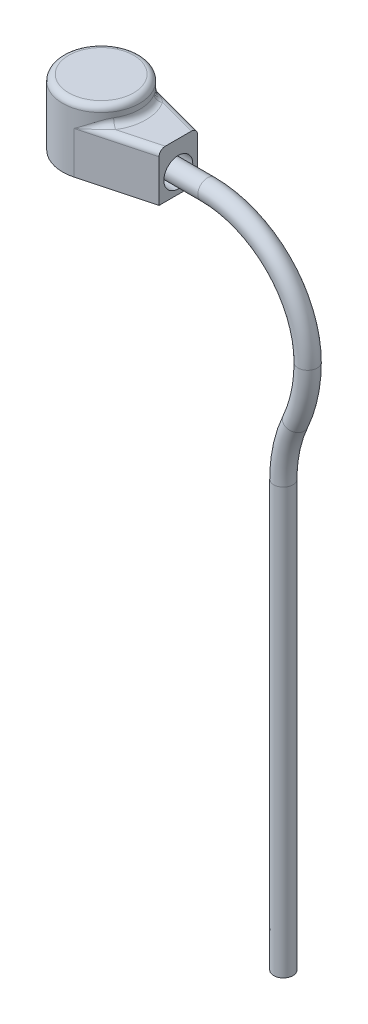
ISO-10303-21;
HEADER;
FILE_DESCRIPTION(('STEP AP214'),'2;1');
FILE_NAME('part.step','',(''),(''),'','','');
FILE_SCHEMA(('AUTOMOTIVE_DESIGN { 1 0 10303 214 1 1 1 1 }'));
ENDSEC;
DATA;
#1=APPLICATION_CONTEXT('core data for automotive mechanical design processes');
#2=APPLICATION_PROTOCOL_DEFINITION('international standard','automotive_design',2000,#1);
#3=PRODUCT_CONTEXT('',#1,'mechanical');
#4=PRODUCT('Part','Part','',(#3));
#5=PRODUCT_RELATED_PRODUCT_CATEGORY('part','',(#4));
#6=PRODUCT_DEFINITION_FORMATION('','',#4);
#7=PRODUCT_DEFINITION_CONTEXT('part definition',#1,'design');
#8=PRODUCT_DEFINITION('design','',#6,#7);
#9=PRODUCT_DEFINITION_SHAPE('','',#8);
#10=(LENGTH_UNIT() NAMED_UNIT(*) SI_UNIT(.MILLI.,.METRE.));
#11=(NAMED_UNIT(*) PLANE_ANGLE_UNIT() SI_UNIT($,.RADIAN.));
#12=(NAMED_UNIT(*) SI_UNIT($,.STERADIAN.) SOLID_ANGLE_UNIT());
#13=UNCERTAINTY_MEASURE_WITH_UNIT(LENGTH_MEASURE(1.E-05),#10,'distance_accuracy_value','');
#14=(GEOMETRIC_REPRESENTATION_CONTEXT(3) GLOBAL_UNCERTAINTY_ASSIGNED_CONTEXT((#13)) GLOBAL_UNIT_ASSIGNED_CONTEXT((#10,
#11,#12)) REPRESENTATION_CONTEXT('',''));
#15=CARTESIAN_POINT('',(0.,0.,0.));
#16=DIRECTION('',(0.,0.,1.));
#17=DIRECTION('',(1.,0.,0.));
#18=AXIS2_PLACEMENT_3D('',#15,#16,#17);
#19=CARTESIAN_POINT('',(9.99999999999999,3.175,0.));
#20=DIRECTION('',(1.,0.,0.));
#21=DIRECTION('',(0.,1.,0.));
#22=AXIS2_PLACEMENT_3D('',#19,#20,#21);
#23=PLANE('',#22);
#24=CARTESIAN_POINT('',(9.99999999999999,3.175,0.));
#25=DIRECTION('',(1.,0.,0.));
#26=DIRECTION('',(0.,1.,0.));
#27=AXIS2_PLACEMENT_3D('',#24,#25,#26);
#28=CIRCLE('',#27,1.5875);
#29=CARTESIAN_POINT('',(9.99999999999999,4.7625,0.));
#30=VERTEX_POINT('',#29);
#31=EDGE_CURVE('E70',#30,#30,#28,.T.);
#32=ORIENTED_EDGE('',*,*,#31,.F.);
#33=EDGE_LOOP('',(#32));
#34=FACE_BOUND('',#33,.T.);
#35=ADVANCED_FACE('F48',(#34),#23,.F.);
#36=CARTESIAN_POINT('',(30.,-101.979758106178,0.));
#37=DIRECTION('',(0.,-1.,0.));
#38=DIRECTION('',(1.,0.,0.));
#39=AXIS2_PLACEMENT_3D('',#36,#37,#38);
#40=PLANE('',#39);
#41=CARTESIAN_POINT('',(30.,-101.979758106178,0.));
#42=DIRECTION('',(0.,-1.,0.));
#43=DIRECTION('',(1.,0.,0.));
#44=AXIS2_PLACEMENT_3D('',#41,#42,#43);
#45=CIRCLE('',#44,1.5875);
#46=CARTESIAN_POINT('',(31.5875,-101.979758106178,0.));
#47=VERTEX_POINT('',#46);
#48=EDGE_CURVE('E11',#47,#47,#45,.T.);
#49=ORIENTED_EDGE('',*,*,#48,.T.);
#50=EDGE_LOOP('',(#49));
#51=FACE_BOUND('',#50,.T.);
#52=ADVANCED_FACE('F77',(#51),#40,.T.);
#53=CARTESIAN_POINT('',(9.99999999999999,3.175,0.));
#54=DIRECTION('',(1.,0.,0.));
#55=DIRECTION('',(0.,1.,0.));
#56=AXIS2_PLACEMENT_3D('',#53,#54,#55);
#57=CYLINDRICAL_SURFACE('',#56,1.5875);
#58=CARTESIAN_POINT('',(17.5,3.175,0.));
#59=DIRECTION('',(1.,0.,0.));
#60=DIRECTION('',(0.,1.,0.));
#61=AXIS2_PLACEMENT_3D('',#58,#59,#60);
#62=CIRCLE('',#61,1.5875);
#63=CARTESIAN_POINT('',(17.5,4.7625,0.));
#64=VERTEX_POINT('',#63);
#65=EDGE_CURVE('E67',#64,#64,#62,.T.);
#66=ORIENTED_EDGE('',*,*,#65,.F.);
#67=EDGE_LOOP('',(#66));
#68=FACE_BOUND('',#67,.T.);
#69=ORIENTED_EDGE('',*,*,#31,.T.);
#70=EDGE_LOOP('',(#69));
#71=FACE_BOUND('',#70,.T.);
#72=ADVANCED_FACE('F74',(#68,#71),#57,.T.);
#73=CARTESIAN_POINT('',(17.5,-13.325,0.));
#74=DIRECTION('',(0.,0.,-1.));
#75=DIRECTION('',(-1.,0.,0.));
#76=AXIS2_PLACEMENT_3D('',#73,#74,#75);
#77=TOROIDAL_SURFACE('',#76,16.5,1.5875);
#78=CARTESIAN_POINT('',(34.,-13.325,0.));
#79=DIRECTION('',(0.,-1.,0.));
#80=DIRECTION('',(1.,0.,0.));
#81=AXIS2_PLACEMENT_3D('',#78,#79,#80);
#82=CIRCLE('',#81,1.5875);
#83=CARTESIAN_POINT('',(35.5875,-13.325,0.));
#84=VERTEX_POINT('',#83);
#85=EDGE_CURVE('E62',#84,#84,#82,.T.);
#86=CARTESIAN_POINT('',(17.5,-13.325,0.));
#87=DIRECTION('',(0.,0.,-1.));
#88=DIRECTION('',(-1.,0.,0.));
#89=AXIS2_PLACEMENT_3D('',#86,#87,#88);
#90=CIRCLE('',#89,18.0875);
#91=EDGE_CURVE('',#64,#84,#90,.T.);
#92=ORIENTED_EDGE('',*,*,#65,.T.);
#93=ORIENTED_EDGE('',*,*,#85,.F.);
#94=ORIENTED_EDGE('',*,*,#91,.T.);
#95=ORIENTED_EDGE('',*,*,#91,.F.);
#96=EDGE_LOOP('',(#92,#94,#93,#95));
#97=FACE_BOUND('',#96,.T.);
#98=ADVANCED_FACE('F95',(#97),#77,.T.);
#99=CARTESIAN_POINT('',(11.,-13.325,0.));
#100=DIRECTION('',(0.,0.,-1.));
#101=DIRECTION('',(-1.,0.,0.));
#102=AXIS2_PLACEMENT_3D('',#99,#100,#101);
#103=TOROIDAL_SURFACE('',#102,23.,1.5875);
#104=CARTESIAN_POINT('',(31.978021978022,-22.7548777240019,0.));
#105=DIRECTION('',(-0.409994683652255,-0.912087912087912,0.));
#106=DIRECTION('',(0.912087912087912,-0.409994683652255,0.));
#107=AXIS2_PLACEMENT_3D('',#104,#105,#106);
#108=CIRCLE('',#107,1.5875);
#109=CARTESIAN_POINT('',(33.4259615384615,-23.4057442842998,0.));
#110=VERTEX_POINT('',#109);
#111=EDGE_CURVE('E58',#110,#110,#108,.T.);
#112=CARTESIAN_POINT('',(11.,-13.325,0.));
#113=DIRECTION('',(0.,0.,-1.));
#114=DIRECTION('',(-1.,0.,0.));
#115=AXIS2_PLACEMENT_3D('',#112,#113,#114);
#116=CIRCLE('',#115,24.5875);
#117=EDGE_CURVE('',#84,#110,#116,.T.);
#118=ORIENTED_EDGE('',*,*,#85,.T.);
#119=ORIENTED_EDGE('',*,*,#111,.F.);
#120=ORIENTED_EDGE('',*,*,#117,.T.);
#121=ORIENTED_EDGE('',*,*,#117,.F.);
#122=EDGE_LOOP('',(#118,#120,#119,#121));
#123=FACE_BOUND('',#122,.T.);
#124=ADVANCED_FACE('F89',(#123),#103,.T.);
#125=CARTESIAN_POINT('',(52.5,-31.9797581061776,0.));
#126=DIRECTION('',(0.,0.,1.));
#127=DIRECTION('',(1.,0.,0.));
#128=AXIS2_PLACEMENT_3D('',#125,#126,#127);
#129=TOROIDAL_SURFACE('',#128,22.5,1.5875);
#130=CARTESIAN_POINT('',(30.,-31.9797581061776,0.));
#131=DIRECTION('',(0.,-1.,0.));
#132=DIRECTION('',(1.,0.,0.));
#133=AXIS2_PLACEMENT_3D('',#130,#131,#132);
#134=CIRCLE('',#133,1.5875);
#135=CARTESIAN_POINT('',(31.5875,-31.9797581061776,0.));
#136=VERTEX_POINT('',#135);
#137=EDGE_CURVE('E54',#136,#136,#134,.T.);
#138=ORIENTED_EDGE('',*,*,#137,.F.);
#139=EDGE_LOOP('',(#138));
#140=FACE_BOUND('',#139,.T.);
#141=ORIENTED_EDGE('',*,*,#111,.T.);
#142=EDGE_LOOP('',(#141));
#143=FACE_BOUND('',#142,.T.);
#144=ADVANCED_FACE('F83',(#140,#143),#129,.T.);
#145=CARTESIAN_POINT('',(30.,-31.9797581061776,0.));
#146=DIRECTION('',(0.,-1.,0.));
#147=DIRECTION('',(1.,0.,0.));
#148=AXIS2_PLACEMENT_3D('',#145,#146,#147);
#149=CYLINDRICAL_SURFACE('',#148,1.5875);
#150=ORIENTED_EDGE('',*,*,#48,.F.);
#151=EDGE_LOOP('',(#150));
#152=FACE_BOUND('',#151,.T.);
#153=ORIENTED_EDGE('',*,*,#137,.T.);
#154=EDGE_LOOP('',(#153));
#155=FACE_BOUND('',#154,.T.);
#156=ADVANCED_FACE('F81',(#152,#155),#149,.T.);
#157=CLOSED_SHELL('',(#35,#52,#72,#98,#124,#144,#156));
#158=MANIFOLD_SOLID_BREP('B2',#157);
#159=CARTESIAN_POINT('',(0.,10.795,0.));
#160=DIRECTION('',(0.,-1.,0.));
#161=DIRECTION('',(0.,0.,-1.));
#162=AXIS2_PLACEMENT_3D('',#159,#160,#161);
#163=CYLINDRICAL_SURFACE('',#162,6.35);
#164=CARTESIAN_POINT('',(0.,9.795,0.));
#165=DIRECTION('',(0.,1.,0.));
#166=DIRECTION('',(0.,0.,1.));
#167=AXIS2_PLACEMENT_3D('',#164,#165,#166);
#168=CIRCLE('',#167,6.35);
#169=CARTESIAN_POINT('',(0.,9.795,6.35));
#170=VERTEX_POINT('',#169);
#171=EDGE_CURVE('E259',#170,#170,#168,.F.);
#172=ORIENTED_EDGE('',*,*,#171,.T.);
#173=EDGE_LOOP('',(#172));
#174=FACE_BOUND('',#173,.T.);
#175=CARTESIAN_POINT('',(0.,8.9375,0.));
#176=DIRECTION('',(0.,1.,0.));
#177=DIRECTION('',(0.,0.,1.));
#178=AXIS2_PLACEMENT_3D('',#175,#176,#177);
#179=CIRCLE('',#178,6.35);
#180=CARTESIAN_POINT('',(5.40096125308822,8.9375,3.33947863335577));
#181=VERTEX_POINT('',#180);
#182=CARTESIAN_POINT('',(5.40096125308822,8.9375,-3.33947863335577));
#183=VERTEX_POINT('',#182);
#184=EDGE_CURVE('E262',#181,#183,#179,.T.);
#185=ORIENTED_EDGE('',*,*,#184,.T.);
#186=CARTESIAN_POINT('',(5.80509051941081,8.79737296245185,-2.57360137967144));
#187=CARTESIAN_POINT('',(5.65427091405741,7.58830308200132,-2.91379449119755));
#188=CARTESIAN_POINT('',(6.81433256374569,7.86743648122593,-3.33411507915544));
#189=CARTESIAN_POINT('',(5.77655646939977,8.82245984838676,-2.63799178420679));
#190=CARTESIAN_POINT('',(5.63977985810667,7.62303126237927,-2.936387265703));
#191=CARTESIAN_POINT('',(6.77310285995521,7.87997992391898,-3.3779941670818));
#192=CARTESIAN_POINT('',(5.74655643818847,8.84379184739409,-2.70274031968297));
#193=CARTESIAN_POINT('',(5.62368051076614,7.65743531777487,-2.96308513824146));
#194=CARTESIAN_POINT('',(6.73018124758679,7.8906459233856,-3.42230622980106));
#195=CARTESIAN_POINT('',(5.68385131187813,8.87951862292704,-2.83221937284007));
#196=CARTESIAN_POINT('',(5.58814079339317,7.72345313459057,-3.02342879226179));
#197=CARTESIAN_POINT('',(6.64131417826352,7.90850931125225,-3.51131016094717));
#198=CARTESIAN_POINT('',(5.65115102948967,8.89392544244868,-2.89694972472541));
#199=CARTESIAN_POINT('',(5.56879692184164,7.75509813437106,-3.05688089295068));
#200=CARTESIAN_POINT('',(6.59537412977062,7.91571272114997,-3.55600123148707));
#201=CARTESIAN_POINT('',(5.54988330760897,8.92749135759064,-3.08902526647769));
#202=CARTESIAN_POINT('',(5.50642470225579,7.84275766366459,-3.16432543386376));
#203=CARTESIAN_POINT('',(6.45431658759679,7.93249567894252,-3.68922596963442));
#204=CARTESIAN_POINT('',(5.47755331784653,8.93748642939584,-3.21560714882213));
#205=CARTESIAN_POINT('',(5.45793098083071,7.89455760726814,-3.24738672682887));
#206=CARTESIAN_POINT('',(6.35509983231784,7.93749321474731,-3.77783211796091));
#207=CARTESIAN_POINT('',(5.29174430226191,8.93751935109091,-3.51611397903788));
#208=CARTESIAN_POINT('',(5.32374898273533,7.99570072815161,-3.46429273140111));
#209=CARTESIAN_POINT('',(6.10378651001369,7.93750967547503,-3.99022136251142));
#210=CARTESIAN_POINT('',(5.17386105325476,8.91724279800737,-3.68723813225157));
#211=CARTESIAN_POINT('',(5.23068586494251,8.03783008025688,-3.60614587116485));
#212=CARTESIAN_POINT('',(5.94716722562484,7.9273713989613,-4.11291170365072));
#213=CARTESIAN_POINT('',(4.92393702876992,8.84730601998019,-4.01500032258211));
#214=CARTESIAN_POINT('',(5.01875452490956,8.08391760726054,-3.89694536613299));
#215=CARTESIAN_POINT('',(5.62018259904444,7.89240301003273,-4.35139450048476));
#216=CARTESIAN_POINT('',(4.79181820231875,8.7974762730902,-4.17154870862051));
#217=CARTESIAN_POINT('',(4.90051565098849,8.08970081825433,-4.04629695390145));
#218=CARTESIAN_POINT('',(5.44974288894634,7.86748813664489,-4.4671428842935));
#219=CARTESIAN_POINT('',(4.54979520825478,8.69118531748057,-4.43232260521138));
#220=CARTESIAN_POINT('',(4.67398705990213,8.07292735970824,-4.30445892738367));
#221=CARTESIAN_POINT('',(5.14127901000571,7.81434265866443,-4.66312446595537));
#222=CARTESIAN_POINT('',(4.44216435390571,8.6391819870271,-4.54009130479158));
#223=CARTESIAN_POINT('',(4.57106382375464,8.05753997279185,-4.41395472867812));
#224=CARTESIAN_POINT('',(5.00528618912292,7.78834099327116,-4.74521673672314));
#225=CARTESIAN_POINT('',(4.22152175675007,8.52564389332341,-4.7459489159669));
#226=CARTESIAN_POINT('',(4.35594238198373,8.01283660795774,-4.62624894875358));
#227=CARTESIAN_POINT('',(4.72867926630903,7.73157194641394,-4.90420249616437));
#228=CARTESIAN_POINT('',(4.10850817370216,8.46410585392083,-4.84403448137368));
#229=CARTESIAN_POINT('',(4.24360902599271,7.98381974019386,-4.72961288099691));
#230=CARTESIAN_POINT('',(4.58806358908441,7.70080292687392,-4.98109418480895));
#231=CARTESIAN_POINT('',(3.7624637876194,8.26849820368118,-5.12390442674331));
#232=CARTESIAN_POINT('',(3.89904967860004,7.88146448573069,-5.0233930073966));
#233=CARTESIAN_POINT('',(4.16045997191679,7.60299910201354,-5.20389884927047));
#234=CARTESIAN_POINT('',(3.52237650414568,8.12340986745129,-5.29135812612384));
#235=CARTESIAN_POINT('',(3.64961703784563,7.79109979379987,-5.20771703315276));
#236=CARTESIAN_POINT('',(3.86764822156584,7.53045493377258,-5.34198367890217));
#237=CARTESIAN_POINT('',(3.01850260333603,7.81080219725053,-5.59473550552911));
#238=CARTESIAN_POINT('',(3.12175842929269,7.58187411530229,-5.539657438898));
#239=CARTESIAN_POINT('',(3.2600663570105,7.37415109857652,-5.60211130477031));
#240=CARTESIAN_POINT('',(2.7541598761738,7.64263528587335,-5.72920084930218));
#241=CARTESIAN_POINT('',(2.83885805341438,7.46112205085921,-5.68970765699723));
#242=CARTESIAN_POINT('',(2.94488481810297,7.29006764292446,-5.72333407457153));
#243=CARTESIAN_POINT('',(2.21288814927997,7.29807067957903,-5.95918800735237));
#244=CARTESIAN_POINT('',(2.25961342769665,7.20886166022736,-5.94277928175539));
#245=CARTESIAN_POINT('',(2.30606814875874,7.11778533980173,-5.9435543544058));
#246=CARTESIAN_POINT('',(1.93596558152202,7.12167718964454,-6.05472947945923));
#247=CARTESIAN_POINT('',(1.95917492940163,7.07564662078983,-6.04841327828948));
#248=CARTESIAN_POINT('',(1.98243737356049,7.02958859482242,-6.04256307188301));
#249=CARTESIAN_POINT('',(1.64991302946346,6.94278674072212,-6.13190884633118));
#250=CARTESIAN_POINT('',(1.65057888416707,6.9414650633106,-6.1317300036406));
#251=CARTESIAN_POINT('',(1.65124554727179,6.94014337036106,-6.13155425190584));
#252=CARTESIAN_POINT('',(1.64568498731159,6.94014334663085,-6.13304492266468));
#253=CARTESIAN_POINT('',(1.64601801041058,6.93948251453264,-6.1329558833012));
#254=CARTESIAN_POINT('',(1.64635099441425,6.93882167331542,-6.13286670682013));
#255=CARTESIAN_POINT('',(1.6414558471061,6.9375,-6.13417661157561));
#256=CARTESIAN_POINT('',(1.6414558471061,6.9375,-6.13417661157561));
#257=CARTESIAN_POINT('',(1.6414558471061,6.9375,-6.13417661157561));
#258=(BOUNDED_SURFACE() B_SPLINE_SURFACE(3,2,((#186,#187,#188),(#189,#190,#191),(#192,#193,
#194),(#195,#196,#197),(#198,#199,#200),(#201,#202,#203),(#204,#205,#206),(#207,#208,#209),
(#210,#211,#212),(#213,#214,#215),(#216,#217,#218),(#219,#220,#221),(#222,#223,#224),(#225,#226,
#227),(#228,#229,#230),(#231,#232,#233),(#234,#235,#236),(#237,#238,#239),(#240,#241,#242),
(#243,#244,#245),(#246,#247,#248),(#249,#250,#251),(#252,#253,#254),(#255,#256,#257)),
.UNSPECIFIED.,.F.,.F.,.F.) B_SPLINE_SURFACE_WITH_KNOTS((4,2,2,2,2,2,2,2,2,2,2,4),(3,3),(0.,
0.255646263952791,0.510846332075021,1.01597880700703,1.73627573136209,2.46074491059749,
3.0114331855241,3.56231109980873,4.66379218243212,5.80758658856644,6.95080262284505,
6.96794905825647),(0.,1.),
.UNSPECIFIED.) GEOMETRIC_REPRESENTATION_ITEM() RATIONAL_B_SPLINE_SURFACE(((1.,0.620134572034382,
1.),(1.,0.626883811033151,1.),(1.,0.633853748065402,1.),(1.,0.648094447426861,1.),(1.,
0.65536466347388,1.),(1.,0.677300401518751,1.),(1.,0.69223540054461,1.),(1.,0.728312722734343,
1.),(1.,0.749389305721959,1.),(1.,0.789890006408044,1.),(1.,0.809303845188846,1.),(1.,
0.841266957193318,1.),(1.,0.854345799347387,1.),(1.,0.878911195334434,1.),(1.,0.890397199283436,
1.),(1.,0.922330636022316,1.),(1.,0.940260478511041,1.),(1.,0.969725622618364,1.),(1.,
0.98098881917168,1.),(1.,0.996067289836878,1.),(1.,0.99988632719036,1.),(1.,0.999999167413386,
1.),(1.,1.00000000073605,1.),(1.,1.,1.))) REPRESENTATION_ITEM('') SURFACE());
#259=CARTESIAN_POINT('',(5.80509051941081,8.79737296245185,-2.57360137967144));
#260=CARTESIAN_POINT('',(5.77655646939977,8.82245984838676,-2.63799178420679));
#261=CARTESIAN_POINT('',(5.74655643818846,8.84379184739409,-2.70274031968297));
#262=CARTESIAN_POINT('',(5.68385131187813,8.87951862292704,-2.83221937284007));
#263=CARTESIAN_POINT('',(5.65115102948967,8.89392544244868,-2.89694972472541));
#264=CARTESIAN_POINT('',(5.54988330760897,8.92749135759064,-3.08902526647769));
#265=CARTESIAN_POINT('',(5.47755331784653,8.93748642939583,-3.21560714882213));
#266=CARTESIAN_POINT('',(5.29174430226192,8.93751935109091,-3.51611397903788));
#267=CARTESIAN_POINT('',(5.17386105325476,8.91724279800737,-3.68723813225157));
#268=CARTESIAN_POINT('',(4.92393702876992,8.84730601998019,-4.01500032258211));
#269=CARTESIAN_POINT('',(4.79181820231875,8.7974762730902,-4.17154870862051));
#270=CARTESIAN_POINT('',(4.54979520825478,8.69118531748057,-4.43232260521138));
#271=CARTESIAN_POINT('',(4.44216435390571,8.6391819870271,-4.54009130479158));
#272=CARTESIAN_POINT('',(4.22152175675007,8.52564389332341,-4.7459489159669));
#273=CARTESIAN_POINT('',(4.10850817370216,8.46410585392084,-4.84403448137368));
#274=CARTESIAN_POINT('',(3.7624637876194,8.26849820368118,-5.12390442674331));
#275=CARTESIAN_POINT('',(3.52237650414568,8.12340986745129,-5.29135812612385));
#276=CARTESIAN_POINT('',(3.01850260333603,7.81080219725053,-5.59473550552911));
#277=CARTESIAN_POINT('',(2.7541598761738,7.64263528587335,-5.72920084930218));
#278=CARTESIAN_POINT('',(2.21288814927997,7.29807067957903,-5.95918800735237));
#279=CARTESIAN_POINT('',(1.93596558152202,7.12167718964453,-6.05472947945924));
#280=CARTESIAN_POINT('',(1.64991302946346,6.94278674072212,-6.13190884633118));
#281=CARTESIAN_POINT('',(1.64568498731159,6.94014334663085,-6.13304492266468));
#282=CARTESIAN_POINT('',(1.6414558471061,6.9375,-6.13417661157561));
#283=B_SPLINE_CURVE_WITH_KNOTS('',3,(#259,#260,#261,#262,#263,#264,#265,#266,#267,#268,#269,
#270,#271,#272,#273,#274,#275,#276,#277,#278,#279,#280,#281,#282),.UNSPECIFIED.,.F.,.F.,(4,2,2,
2,2,2,2,2,2,2,2,4),(0.,0.255646263952791,0.510846332075021,1.01597880700703,1.73627573136209,
2.46074491059749,3.0114331855241,3.56231109980873,4.66379218243212,5.80758658856644,
6.95080262284505,6.96794905825647),.UNSPECIFIED.);
#284=CARTESIAN_POINT('',(1.6414558471061,6.9375,-6.13417661157561));
#285=VERTEX_POINT('',#284);
#286=EDGE_CURVE('E46',#183,#285,#283,.T.);
#287=ORIENTED_EDGE('',*,*,#286,.T.);
#288=DIRECTION('',(0.,-1.,0.));
#289=VECTOR('',#288,1.);
#290=CARTESIAN_POINT('',(1.6414558471061,7.9375,-6.13417661157561));
#291=LINE('',#290,#289);
#292=CARTESIAN_POINT('',(1.6414558471061,0.,-6.13417661157561));
#293=VERTEX_POINT('',#292);
#294=EDGE_CURVE('E246',#285,#293,#291,.T.);
#295=ORIENTED_EDGE('',*,*,#294,.T.);
#296=CARTESIAN_POINT('',(0.,0.,0.));
#297=DIRECTION('',(0.,1.,0.));
#298=DIRECTION('',(0.,0.,1.));
#299=AXIS2_PLACEMENT_3D('',#296,#297,#298);
#300=CIRCLE('',#299,6.35);
#301=CARTESIAN_POINT('',(1.6414558471061,0.,6.13417661157561));
#302=VERTEX_POINT('',#301);
#303=EDGE_CURVE('E251',#293,#302,#300,.T.);
#304=ORIENTED_EDGE('',*,*,#303,.T.);
#305=DIRECTION('',(0.,-1.,0.));
#306=VECTOR('',#305,1.);
#307=CARTESIAN_POINT('',(1.6414558471061,7.9375,6.13417661157561));
#308=LINE('',#307,#306);
#309=CARTESIAN_POINT('',(1.6414558471061,6.9375,6.13417661157561));
#310=VERTEX_POINT('',#309);
#311=EDGE_CURVE('E221',#310,#302,#308,.T.);
#312=ORIENTED_EDGE('',*,*,#311,.F.);
#313=CARTESIAN_POINT('',(6.81433256374568,7.86743648122593,3.33411507915544));
#314=CARTESIAN_POINT('',(5.65427091405741,7.58830308200132,2.91379449119755));
#315=CARTESIAN_POINT('',(5.80509051941081,8.79737296245185,2.57360137967144));
#316=CARTESIAN_POINT('',(6.77310285995521,7.87997992391898,3.3779941670818));
#317=CARTESIAN_POINT('',(5.63977985810667,7.62303126237928,2.936387265703));
#318=CARTESIAN_POINT('',(5.77655646939977,8.82245984838676,2.63799178420679));
#319=CARTESIAN_POINT('',(6.73018124758678,7.89064592338561,3.42230622980107));
#320=CARTESIAN_POINT('',(5.62368051076613,7.65743531777488,2.96308513824146));
#321=CARTESIAN_POINT('',(5.74655643818846,8.84379184739409,2.70274031968298));
#322=CARTESIAN_POINT('',(6.6413141782635,7.90850931125225,3.51131016094719));
#323=CARTESIAN_POINT('',(5.58814079339316,7.72345313459059,3.0234287922618));
#324=CARTESIAN_POINT('',(5.68385131187811,8.87951862292705,2.83221937284011));
#325=CARTESIAN_POINT('',(6.59537412977059,7.91571272114998,3.5560012314871));
#326=CARTESIAN_POINT('',(5.56879692184162,7.75509813437108,3.0568808929507));
#327=CARTESIAN_POINT('',(5.65115102948965,8.89392544244869,2.89694972472545));
#328=CARTESIAN_POINT('',(6.45431658759676,7.93249567894252,3.68922596963444));
#329=CARTESIAN_POINT('',(5.50642470225577,7.8427576636646,3.16432543386378));
#330=CARTESIAN_POINT('',(5.54988330760895,8.92749135759064,3.08902526647773));
#331=CARTESIAN_POINT('',(6.35509983231783,7.93749321474731,3.77783211796092));
#332=CARTESIAN_POINT('',(5.45793098083071,7.89455760726815,3.24738672682888));
#333=CARTESIAN_POINT('',(5.47755331784653,8.93748642939583,3.21560714882215));
#334=CARTESIAN_POINT('',(6.1037865100137,7.93750967547503,3.99022136251141));
#335=CARTESIAN_POINT('',(5.32374898273534,7.99570072815161,3.4642927314011));
#336=CARTESIAN_POINT('',(5.29174430226193,8.93751935109091,3.51611397903786));
#337=CARTESIAN_POINT('',(5.94716722562487,7.9273713989613,4.1129117036507));
#338=CARTESIAN_POINT('',(5.23068586494253,8.03783008025687,3.60614587116483));
#339=CARTESIAN_POINT('',(5.17386105325479,8.91724279800738,3.68723813225153));
#340=CARTESIAN_POINT('',(5.62018259904447,7.89240301003274,4.35139450048474));
#341=CARTESIAN_POINT('',(5.01875452490959,8.08391760726054,3.89694536613296));
#342=CARTESIAN_POINT('',(4.92393702876995,8.8473060199802,4.01500032258208));
#343=CARTESIAN_POINT('',(5.44974288894635,7.8674881366449,4.46714288429349));
#344=CARTESIAN_POINT('',(4.9005156509885,8.08970081825433,4.04629695390144));
#345=CARTESIAN_POINT('',(4.79181820231876,8.79747627309021,4.1715487086205));
#346=CARTESIAN_POINT('',(5.1412790100057,7.81434265866443,4.66312446595538));
#347=CARTESIAN_POINT('',(4.67398705990212,8.07292735970823,4.30445892738368));
#348=CARTESIAN_POINT('',(4.54979520825477,8.69118531748056,4.43232260521139));
#349=CARTESIAN_POINT('',(5.0052861891229,7.78834099327115,4.74521673672316));
#350=CARTESIAN_POINT('',(4.57106382375463,8.05753997279183,4.41395472867813));
#351=CARTESIAN_POINT('',(4.44216435390569,8.63918198702708,4.54009130479159));
#352=CARTESIAN_POINT('',(4.72867926630896,7.73157194641393,4.9042024961644));
#353=CARTESIAN_POINT('',(4.35594238198368,8.01283660795774,4.62624894875363));
#354=CARTESIAN_POINT('',(4.22152175675001,8.5256438933234,4.74594891596694));
#355=CARTESIAN_POINT('',(4.5880635890843,7.70080292687392,4.981094184809));
#356=CARTESIAN_POINT('',(4.24360902599262,7.98381974019387,4.72961288099697));
#357=CARTESIAN_POINT('',(4.10850817370208,8.46410585392084,4.84403448137374));
#358=CARTESIAN_POINT('',(4.16045997191676,7.60299910201348,5.2038988492705));
#359=CARTESIAN_POINT('',(3.89904967860001,7.88146448573059,5.02339300739663));
#360=CARTESIAN_POINT('',(3.76246378761938,8.26849820368106,5.12390442674334));
#361=CARTESIAN_POINT('',(3.86764822156603,7.53045493377235,5.34198367890212));
#362=CARTESIAN_POINT('',(3.64961703784582,7.79109979379951,5.20771703315272));
#363=CARTESIAN_POINT('',(3.52237650414584,8.12340986745082,5.29135812612381));
#364=CARTESIAN_POINT('',(3.26006635701028,7.37415109857675,5.60211130477037));
#365=CARTESIAN_POINT('',(3.12175842929248,7.58187411530265,5.53965743889805));
#366=CARTESIAN_POINT('',(3.01850260333584,7.81080219725099,5.59473550552916));
#367=CARTESIAN_POINT('',(2.9448848181021,7.29006764292536,5.72333407457175));
#368=CARTESIAN_POINT('',(2.83885805341355,7.46112205086059,5.68970765699745));
#369=CARTESIAN_POINT('',(2.75415987617304,7.64263528587516,5.72920084930239));
#370=CARTESIAN_POINT('',(2.30606814875967,7.11778533980085,5.94355435440555));
#371=CARTESIAN_POINT('',(2.25961342769753,7.20886166022602,5.94277928175516));
#372=CARTESIAN_POINT('',(2.21288814928078,7.29807067957726,5.95918800735215));
#373=CARTESIAN_POINT('',(1.98243737356388,7.02958859481908,6.04256307188212));
#374=CARTESIAN_POINT('',(1.95917492940479,7.07564662078481,6.04841327828864));
#375=CARTESIAN_POINT('',(1.93596558152497,7.12167718963785,6.05472947945843));
#376=CARTESIAN_POINT('',(1.6512455472719,6.94014337036096,6.13155425190581));
#377=CARTESIAN_POINT('',(1.65057888416717,6.94146506331044,6.13173000364058));
#378=CARTESIAN_POINT('',(1.64991302946356,6.94278674072192,6.13190884633116));
#379=CARTESIAN_POINT('',(1.64635099441431,6.93882167331537,6.13286670682012));
#380=CARTESIAN_POINT('',(1.64601801041063,6.93948251453256,6.13295588330119));
#381=CARTESIAN_POINT('',(1.64568498731164,6.94014334663075,6.13304492266466));
#382=CARTESIAN_POINT('',(1.64145584710611,6.9375,6.1341766115756));
#383=CARTESIAN_POINT('',(1.64145584710611,6.9375,6.1341766115756));
#384=CARTESIAN_POINT('',(1.64145584710611,6.9375,6.1341766115756));
#385=(BOUNDED_SURFACE() B_SPLINE_SURFACE(3,2,((#313,#314,#315),(#316,#317,#318),(#319,#320,
#321),(#322,#323,#324),(#325,#326,#327),(#328,#329,#330),(#331,#332,#333),(#334,#335,#336),
(#337,#338,#339),(#340,#341,#342),(#343,#344,#345),(#346,#347,#348),(#349,#350,#351),(#352,#353,
#354),(#355,#356,#357),(#358,#359,#360),(#361,#362,#363),(#364,#365,#366),(#367,#368,#369),
(#370,#371,#372),(#373,#374,#375),(#376,#377,#378),(#379,#380,#381),(#382,#383,#384)),
.UNSPECIFIED.,.F.,.F.,.F.) B_SPLINE_SURFACE_WITH_KNOTS((4,2,2,2,2,2,2,2,2,2,2,4),(3,3),(0.,
0.255646263952824,0.51084633207509,1.01597880700703,1.73627573136202,2.46074491059749,
3.01143318552415,3.56231109980887,4.66379218243212,5.80758658856638,6.95080262284505,
6.96794905825646),(0.,1.),
.UNSPECIFIED.) GEOMETRIC_REPRESENTATION_ITEM() RATIONAL_B_SPLINE_SURFACE(((1.,0.620134572034382,
1.),(1.,0.626883811033152,1.),(1.,0.633853748065405,1.),(1.,0.648094447426865,1.),(1.,
0.655364663473885,1.),(1.,0.677300401518755,1.),(1.,0.692235400544612,1.),(1.,0.728312722734341,
1.),(1.,0.749389305721955,1.),(1.,0.78989000640804,1.),(1.,0.809303845188845,1.),(1.,
0.84126695719332,1.),(1.,0.854345799347389,1.),(1.,0.878911195334439,1.),(1.,0.890397199283443,
1.),(1.,0.922330636022321,1.),(1.,0.940260478511043,1.),(1.,0.969725622618364,1.),(1.,
0.980988819171678,1.),(1.,0.996067289836878,1.),(1.,0.999886327190362,1.),(1.,0.999999167413386,
1.),(1.,1.00000000073605,1.),(1.,1.,1.))) REPRESENTATION_ITEM('') SURFACE());
#386=CARTESIAN_POINT('',(5.80509051941081,8.79737296245185,2.57360137967144));
#387=CARTESIAN_POINT('',(5.77655646939977,8.82245984838676,2.63799178420679));
#388=CARTESIAN_POINT('',(5.74655643818846,8.84379184739409,2.70274031968298));
#389=CARTESIAN_POINT('',(5.68385131187811,8.87951862292705,2.83221937284011));
#390=CARTESIAN_POINT('',(5.65115102948965,8.89392544244869,2.89694972472545));
#391=CARTESIAN_POINT('',(5.54988330760895,8.92749135759064,3.08902526647773));
#392=CARTESIAN_POINT('',(5.47755331784653,8.93748642939583,3.21560714882215));
#393=CARTESIAN_POINT('',(5.29174430226193,8.93751935109091,3.51611397903786));
#394=CARTESIAN_POINT('',(5.17386105325479,8.91724279800738,3.68723813225153));
#395=CARTESIAN_POINT('',(4.92393702876995,8.8473060199802,4.01500032258208));
#396=CARTESIAN_POINT('',(4.79181820231876,8.79747627309021,4.1715487086205));
#397=CARTESIAN_POINT('',(4.54979520825477,8.69118531748056,4.4323226052114));
#398=CARTESIAN_POINT('',(4.44216435390569,8.63918198702708,4.54009130479159));
#399=CARTESIAN_POINT('',(4.22152175675001,8.52564389332339,4.74594891596694));
#400=CARTESIAN_POINT('',(4.10850817370208,8.46410585392084,4.84403448137374));
#401=CARTESIAN_POINT('',(3.76246378761938,8.26849820368106,5.12390442674334));
#402=CARTESIAN_POINT('',(3.52237650414584,8.12340986745082,5.29135812612381));
#403=CARTESIAN_POINT('',(3.01850260333584,7.81080219725099,5.59473550552916));
#404=CARTESIAN_POINT('',(2.75415987617304,7.64263528587516,5.72920084930238));
#405=CARTESIAN_POINT('',(2.21288814928078,7.29807067957726,5.95918800735215));
#406=CARTESIAN_POINT('',(1.93596558152497,7.12167718963785,6.05472947945844));
#407=CARTESIAN_POINT('',(1.64991302946356,6.94278674072192,6.13190884633116));
#408=CARTESIAN_POINT('',(1.64568498731164,6.94014334663075,6.13304492266466));
#409=CARTESIAN_POINT('',(1.64145584710611,6.9375,6.1341766115756));
#410=B_SPLINE_CURVE_WITH_KNOTS('',3,(#386,#387,#388,#389,#390,#391,#392,#393,#394,#395,#396,
#397,#398,#399,#400,#401,#402,#403,#404,#405,#406,#407,#408,#409),.UNSPECIFIED.,.F.,.F.,(4,2,2,
2,2,2,2,2,2,2,2,4),(0.,0.255646263952824,0.51084633207509,1.01597880700703,1.73627573136202,
2.46074491059749,3.01143318552415,3.56231109980887,4.66379218243212,5.80758658856638,
6.95080262284505,6.96794905825646),.UNSPECIFIED.);
#411=EDGE_CURVE('E162',#310,#181,#410,.F.);
#412=ORIENTED_EDGE('',*,*,#411,.T.);
#413=EDGE_LOOP('',(#185,#287,#295,#304,#312,#412));
#414=FACE_BOUND('',#413,.T.);
#415=ADVANCED_FACE('F148',(#174,#414),#163,.T.);
#416=CARTESIAN_POINT('',(0.,10.795,0.));
#417=DIRECTION('',(0.,1.,0.));
#418=DIRECTION('',(0.,0.,1.));
#419=AXIS2_PLACEMENT_3D('',#416,#417,#418);
#420=PLANE('',#419);
#421=CARTESIAN_POINT('',(0.,10.795,0.));
#422=DIRECTION('',(0.,1.,0.));
#423=DIRECTION('',(0.,0.,1.));
#424=AXIS2_PLACEMENT_3D('',#421,#422,#423);
#425=CIRCLE('',#424,5.35);
#426=CARTESIAN_POINT('',(0.,10.795,5.35));
#427=VERTEX_POINT('',#426);
#428=EDGE_CURVE('E276',#427,#427,#425,.T.);
#429=ORIENTED_EDGE('',*,*,#428,.T.);
#430=EDGE_LOOP('',(#429));
#431=FACE_BOUND('',#430,.T.);
#432=ADVANCED_FACE('F298',(#431),#420,.T.);
#433=CARTESIAN_POINT('',(0.,0.,0.));
#434=DIRECTION('',(0.,1.,0.));
#435=DIRECTION('',(0.,0.,1.));
#436=AXIS2_PLACEMENT_3D('',#433,#434,#435);
#437=PLANE('',#436);
#438=CARTESIAN_POINT('',(0.,0.,0.));
#439=DIRECTION('',(0.,1.,0.));
#440=DIRECTION('',(0.,0.,1.));
#441=AXIS2_PLACEMENT_3D('',#438,#439,#440);
#442=CIRCLE('',#441,5.07200000000001);
#443=CARTESIAN_POINT('',(0.,0.,5.07200000000001));
#444=VERTEX_POINT('',#443);
#445=EDGE_CURVE('E256',#444,#444,#442,.T.);
#446=ORIENTED_EDGE('',*,*,#445,.T.);
#447=EDGE_LOOP('',(#446));
#448=FACE_BOUND('',#447,.T.);
#449=ORIENTED_EDGE('',*,*,#303,.F.);
#450=DIRECTION('',(0.966012064815056,0.,0.258496983796236));
#451=VECTOR('',#450,1.);
#452=CARTESIAN_POINT('',(12.7,0.,-3.175));
#453=LINE('',#452,#451);
#454=CARTESIAN_POINT('',(12.7,0.,-3.175));
#455=VERTEX_POINT('',#454);
#456=EDGE_CURVE('E231',#293,#455,#453,.T.);
#457=ORIENTED_EDGE('',*,*,#456,.T.);
#458=DIRECTION('',(0.,0.,1.));
#459=VECTOR('',#458,1.);
#460=CARTESIAN_POINT('',(12.7,0.,0.));
#461=LINE('',#460,#459);
#462=CARTESIAN_POINT('',(12.7,0.,3.175));
#463=VERTEX_POINT('',#462);
#464=EDGE_CURVE('E217',#455,#463,#461,.T.);
#465=ORIENTED_EDGE('',*,*,#464,.T.);
#466=DIRECTION('',(-0.966012064815056,0.,0.258496983796236));
#467=VECTOR('',#466,1.);
#468=CARTESIAN_POINT('',(12.7,0.,3.175));
#469=LINE('',#468,#467);
#470=EDGE_CURVE('E225',#463,#302,#469,.T.);
#471=ORIENTED_EDGE('',*,*,#470,.T.);
#472=EDGE_LOOP('',(#449,#457,#465,#471));
#473=FACE_BOUND('',#472,.T.);
#474=ADVANCED_FACE('F233',(#448,#473),#437,.F.);
#475=CARTESIAN_POINT('',(0.,10.414,0.));
#476=DIRECTION('',(0.,-1.,0.));
#477=DIRECTION('',(0.,0.,-1.));
#478=AXIS2_PLACEMENT_3D('',#475,#476,#477);
#479=CYLINDRICAL_SURFACE('',#478,4.572);
#480=CARTESIAN_POINT('',(3.90292613784837,3.175,-2.38125));
#481=CARTESIAN_POINT('',(3.90293968358022,3.29825519046707,-2.3812393200061));
#482=CARTESIAN_POINT('',(3.90885577810591,3.42165255145846,-2.37161445518081));
#483=CARTESIAN_POINT('',(3.93164055296469,3.66459016068911,-2.33363295052987));
#484=CARTESIAN_POINT('',(3.94853031090714,3.78412252045735,-2.30524026067092));
#485=CARTESIAN_POINT('',(3.9907584173537,4.01535183756269,-2.23132570423471));
#486=CARTESIAN_POINT('',(4.01604870721062,4.12708908765322,-2.1859010895028));
#487=CARTESIAN_POINT('',(4.07215293216933,4.34132447351206,-2.07950982132188));
#488=CARTESIAN_POINT('',(4.1029675491924,4.44382146631568,-2.01854124873872));
#489=CARTESIAN_POINT('',(4.17002665785785,4.64683044210127,-1.87637168139694));
#490=CARTESIAN_POINT('',(4.20651024758232,4.7463349316947,-1.7938442412196));
#491=CARTESIAN_POINT('',(4.2788723286803,4.93088428499137,-1.61365022587611));
#492=CARTESIAN_POINT('',(4.31475048606404,5.01592138839261,-1.51597557910841));
#493=CARTESIAN_POINT('',(4.38505974807715,5.17535386777945,-1.29935781937052));
#494=CARTESIAN_POINT('',(4.41918265543893,5.24848013816362,-1.17937108429659));
#495=CARTESIAN_POINT('',(4.47897768617824,5.37304508145485,-0.926686512199772));
#496=CARTESIAN_POINT('',(4.50465558629041,5.42449858622281,-0.793997444647855));
#497=CARTESIAN_POINT('',(4.54293456661002,5.50016697528366,-0.53037378259752));
#498=CARTESIAN_POINT('',(4.55638232698965,5.52615724916921,-0.400074586372879));
#499=CARTESIAN_POINT('',(4.57187099027477,5.55603873765814,-0.136327717304456));
#500=CARTESIAN_POINT('',(4.57391948194114,5.55994465436456,-0.00288219848732058));
#501=CARTESIAN_POINT('',(4.56675171689054,5.5461612674507,0.249892901087353));
#502=CARTESIAN_POINT('',(4.55857807736067,5.53047091326909,0.369368404749618));
#503=CARTESIAN_POINT('',(4.5334990082221,5.48156040144168,0.603704188223505));
#504=CARTESIAN_POINT('',(4.51659291955164,5.44833892066982,0.718564118979932));
#505=CARTESIAN_POINT('',(4.47530750294022,5.36517354837336,0.942298684537903));
#506=CARTESIAN_POINT('',(4.45083544903056,5.31502141730708,1.05107809370158));
#507=CARTESIAN_POINT('',(4.39657290714226,5.19974806833605,1.2589222074741));
#508=CARTESIAN_POINT('',(4.36678058255546,5.13462167893512,1.35798353895501));
#509=CARTESIAN_POINT('',(4.30109695756291,4.98377506686619,1.55418608521077));
#510=CARTESIAN_POINT('',(4.26489365054446,4.89664489592606,1.65013940688995));
#511=CARTESIAN_POINT('',(4.19229502364622,4.7079995548649,1.82674077214562));
#512=CARTESIAN_POINT('',(4.15589956314244,4.60647182794949,1.9073753103161));
#513=CARTESIAN_POINT('',(4.08409363941315,4.38288650204082,2.05687525902903));
#514=CARTESIAN_POINT('',(4.04894983785781,4.25987053607039,2.12444881226718));
#515=CARTESIAN_POINT('',(3.9876288975945,4.00200504000504,2.23744735101536));
#516=CARTESIAN_POINT('',(3.96144185055193,3.86716879488128,2.28289683481118));
#517=CARTESIAN_POINT('',(3.92406370291455,3.60086376204364,2.34652473903951));
#518=CARTESIAN_POINT('',(3.91183200145759,3.47000300000835,2.36660974220349));
#519=CARTESIAN_POINT('',(3.90083515088177,3.20624596498017,2.38470248959525));
#520=CARTESIAN_POINT('',(3.90205843077848,3.07335153910888,2.38272920343694));
#521=CARTESIAN_POINT('',(3.91672617625825,2.82686682833854,2.35851096168521));
#522=CARTESIAN_POINT('',(3.92864195928483,2.712920186229,2.3388008285093));
#523=CARTESIAN_POINT('',(3.96101226850471,2.49020838015086,2.28354621265124));
#524=CARTESIAN_POINT('',(3.9814698941967,2.3814451130023,2.24799598190609));
#525=CARTESIAN_POINT('',(4.02968545525738,2.16652708102758,2.16041977426253));
#526=CARTESIAN_POINT('',(4.05773248583743,2.06071452540116,2.10771949283326));
#527=CARTESIAN_POINT('',(4.11775189121927,1.85880917038325,1.98791125218516));
#528=CARTESIAN_POINT('',(4.14972627986041,1.76272140403882,1.92079588799961));
#529=CARTESIAN_POINT('',(4.21933458696567,1.56900255368962,1.76317997473311));
#530=CARTESIAN_POINT('',(4.25713727717878,1.47301443997992,1.6707254370274));
#531=CARTESIAN_POINT('',(4.33036441188307,1.29734095492592,1.47054035149604));
#532=CARTESIAN_POINT('',(4.36578782136995,1.21766264799957,1.36280321823873));
#533=CARTESIAN_POINT('',(4.43185168029324,1.07436541360568,1.13004483053948));
#534=CARTESIAN_POINT('',(4.46227813750351,1.01141568380692,1.00454635385194));
#535=CARTESIAN_POINT('',(4.51323653273095,0.908174198336577,0.742700773612979));
#536=CARTESIAN_POINT('',(4.53377785475144,0.86786094766286,0.606364102673039));
#537=CARTESIAN_POINT('',(4.56103572067229,0.814772426872845,0.340885028920549));
#538=CARTESIAN_POINT('',(4.56889374372449,0.799717805672191,0.212315412503153));
#539=CARTESIAN_POINT('',(4.57358893603736,0.790696099530688,-0.045742688313951));
#540=CARTESIAN_POINT('',(4.57043068156905,0.796720258258706,-0.175230768870863));
#541=CARTESIAN_POINT('',(4.55410518584053,0.828258235312644,-0.421148622615022));
#542=CARTESIAN_POINT('',(4.54170869377485,0.852271949358485,-0.537827989618981));
#543=CARTESIAN_POINT('',(4.50896350204014,0.916970750217347,-0.765271702046898));
#544=CARTESIAN_POINT('',(4.48861374834891,0.957658046765562,-0.876035261253932));
#545=CARTESIAN_POINT('',(4.44075588673082,1.05617832762383,-1.09351129167788));
#546=CARTESIAN_POINT('',(4.41299448784962,1.11463082516282,-1.19988562558899));
#547=CARTESIAN_POINT('',(4.35309668277597,1.24625590763077,-1.40172572265787));
#548=CARTESIAN_POINT('',(4.32095832814929,1.31943505520597,-1.4971865925961));
#549=CARTESIAN_POINT('',(4.25138090090038,1.48744071838064,-1.68523985086917));
#550=CARTESIAN_POINT('',(4.21374180618141,1.58374259623069,-1.77644425848426));
#551=CARTESIAN_POINT('',(4.14006175961012,1.79057188500015,-1.94198309884371));
#552=CARTESIAN_POINT('',(4.10402246618749,1.90111361499401,-2.01630033967899));
#553=CARTESIAN_POINT('',(4.03618476837193,2.13984735189593,-2.14900582690729));
#554=CARTESIAN_POINT('',(4.00465107760019,2.26861069213645,-2.20652407487101));
#555=CARTESIAN_POINT('',(3.9657173543402,2.46902989834117,-2.27529209841716));
#556=CARTESIAN_POINT('',(3.95414045045427,2.53698552297765,-2.29528660598182));
#557=CARTESIAN_POINT('',(3.93425359926456,2.67484447748919,-2.32921069825747));
#558=CARTESIAN_POINT('',(3.92594144079172,2.74474645464449,-2.34314438856986));
#559=CARTESIAN_POINT('',(3.91402162013136,2.87462673059404,-2.3629919352097));
#560=CARTESIAN_POINT('',(3.90987617703309,2.93441626518703,-2.36982852329091));
#561=CARTESIAN_POINT('',(3.90432504219052,3.05445917719887,-2.37896030173894));
#562=CARTESIAN_POINT('',(3.90291951226775,3.11471258180327,-2.38125522387135));
#563=CARTESIAN_POINT('',(3.90292613784837,3.175,-2.38125));
#564=B_SPLINE_CURVE_WITH_KNOTS('',3,(#480,#481,#482,#483,#484,#485,#486,#487,#488,#489,#490,
#491,#492,#493,#494,#495,#496,#497,#498,#499,#500,#501,#502,#503,#504,#505,#506,#507,#508,#509,
#510,#511,#512,#513,#514,#515,#516,#517,#518,#519,#520,#521,#522,#523,#524,#525,#526,#527,#528,
#529,#530,#531,#532,#533,#534,#535,#536,#537,#538,#539,#540,#541,#542,#543,#544,#545,#546,#547,
#548,#549,#550,#551,#552,#553,#554,#555,#556,#557,#558,#559,#560,#561,#562,#563),.UNSPECIFIED.,
.T.,.F.,(4,2,2,2,2,2,2,2,2,2,2,2,2,2,2,2,2,2,2,2,2,2,2,2,2,2,2,2,2,2,2,2,2,2,2,2,2,2,2,2,2,4),
(0.,0.369520472681667,0.739752806600057,1.10790254409167,1.47609775720678,1.87740560919971,
2.27892804852655,2.71043826086346,3.14165268543112,3.54004039030752,3.93816284737539,
4.2987947774875,4.65945392945357,5.02472124075556,5.39011489042886,5.79213638187195,
6.19451067678747,6.62630971146585,7.05762951530499,7.45410291863444,7.85023539034084,
8.19742309560222,8.54473689125881,8.90780773281703,9.27106553031308,9.68483029951171,
10.0987739090152,10.5273872570208,10.9555929138502,11.342534293648,11.7293149533026,
12.0870018370304,12.4447361400241,12.8167485427572,13.1889270941844,13.6007385927777,
14.0129674745429,14.4437958701461,14.6588310196959,14.8737202765881,15.0544519729837,
15.2351943432189),.UNSPECIFIED.);
#565=CARTESIAN_POINT('',(3.90292613784837,3.175,-2.38125));
#566=VERTEX_POINT('',#565);
#567=EDGE_CURVE('E235',#566,#566,#564,.T.);
#568=ORIENTED_EDGE('',*,*,#567,.T.);
#569=EDGE_LOOP('',(#568));
#570=FACE_BOUND('',#569,.T.);
#571=CARTESIAN_POINT('',(0.,0.500000000000006,0.));
#572=DIRECTION('',(0.,1.,0.));
#573=DIRECTION('',(0.,0.,1.));
#574=AXIS2_PLACEMENT_3D('',#571,#572,#573);
#575=CIRCLE('',#574,4.572);
#576=CARTESIAN_POINT('',(0.,0.500000000000006,4.572));
#577=VERTEX_POINT('',#576);
#578=EDGE_CURVE('E253',#577,#577,#575,.F.);
#579=ORIENTED_EDGE('',*,*,#578,.T.);
#580=EDGE_LOOP('',(#579));
#581=FACE_BOUND('',#580,.T.);
#582=CARTESIAN_POINT('',(0.,10.414,0.));
#583=DIRECTION('',(0.,-1.,0.));
#584=DIRECTION('',(0.,0.,-1.));
#585=AXIS2_PLACEMENT_3D('',#582,#583,#584);
#586=CIRCLE('',#585,4.572);
#587=CARTESIAN_POINT('',(0.,10.414,-4.572));
#588=VERTEX_POINT('',#587);
#589=EDGE_CURVE('E245',#588,#588,#586,.T.);
#590=ORIENTED_EDGE('',*,*,#589,.F.);
#591=EDGE_LOOP('',(#590));
#592=FACE_BOUND('',#591,.T.);
#593=ADVANCED_FACE('F377',(#570,#581,#592),#479,.F.);
#594=CARTESIAN_POINT('',(0.,10.414,0.));
#595=DIRECTION('',(0.,-1.,0.));
#596=DIRECTION('',(0.,0.,-1.));
#597=AXIS2_PLACEMENT_3D('',#594,#595,#596);
#598=PLANE('',#597);
#599=ORIENTED_EDGE('',*,*,#589,.T.);
#600=EDGE_LOOP('',(#599));
#601=FACE_BOUND('',#600,.T.);
#602=ADVANCED_FACE('F395',(#601),#598,.T.);
#603=CARTESIAN_POINT('',(0.,0.500000000000006,0.));
#604=DIRECTION('',(0.,-1.,0.));
#605=DIRECTION('',(0.,0.,-1.));
#606=AXIS2_PLACEMENT_3D('',#603,#604,#605);
#607=CONICAL_SURFACE('',#606,4.572,0.785398163397448);
#608=ORIENTED_EDGE('',*,*,#445,.F.);
#609=EDGE_LOOP('',(#608));
#610=FACE_BOUND('',#609,.T.);
#611=ORIENTED_EDGE('',*,*,#578,.F.);
#612=EDGE_LOOP('',(#611));
#613=FACE_BOUND('',#612,.T.);
#614=ADVANCED_FACE('F301',(#610,#613),#607,.F.);
#615=CARTESIAN_POINT('',(12.7,7.9375,-3.175));
#616=DIRECTION('',(0.258496983796236,0.,-0.966012064815056));
#617=DIRECTION('',(-0.966012064815056,0.,-0.258496983796236));
#618=AXIS2_PLACEMENT_3D('',#615,#616,#617);
#619=PLANE('',#618);
#620=ORIENTED_EDGE('',*,*,#294,.F.);
#621=DIRECTION('',(0.966012064815056,0.,0.258496983796236));
#622=VECTOR('',#621,1.);
#623=CARTESIAN_POINT('',(12.7,6.9375,-3.175));
#624=LINE('',#623,#622);
#625=CARTESIAN_POINT('',(12.7,6.9375,-3.175));
#626=VERTEX_POINT('',#625);
#627=EDGE_CURVE('E170',#285,#626,#624,.T.);
#628=ORIENTED_EDGE('',*,*,#627,.T.);
#629=DIRECTION('',(0.,-1.,0.));
#630=VECTOR('',#629,1.);
#631=CARTESIAN_POINT('',(12.7,7.9375,-3.175));
#632=LINE('',#631,#630);
#633=EDGE_CURVE('E243',#626,#455,#632,.T.);
#634=ORIENTED_EDGE('',*,*,#633,.T.);
#635=ORIENTED_EDGE('',*,*,#456,.F.);
#636=EDGE_LOOP('',(#620,#628,#634,#635));
#637=FACE_BOUND('',#636,.T.);
#638=ADVANCED_FACE('F388',(#637),#619,.T.);
#639=CARTESIAN_POINT('',(12.7,7.9375,3.175));
#640=DIRECTION('',(0.258496983796236,0.,0.966012064815056));
#641=DIRECTION('',(0.966012064815057,0.,-0.258496983796236));
#642=AXIS2_PLACEMENT_3D('',#639,#640,#641);
#643=PLANE('',#642);
#644=DIRECTION('',(0.,-1.,0.));
#645=VECTOR('',#644,1.);
#646=CARTESIAN_POINT('',(12.7,7.9375,3.175));
#647=LINE('',#646,#645);
#648=CARTESIAN_POINT('',(12.7,6.9375,3.175));
#649=VERTEX_POINT('',#648);
#650=EDGE_CURVE('E213',#649,#463,#647,.T.);
#651=ORIENTED_EDGE('',*,*,#650,.F.);
#652=DIRECTION('',(-0.966012064815057,0.,0.258496983796236));
#653=VECTOR('',#652,1.);
#654=CARTESIAN_POINT('',(12.7,6.9375,3.175));
#655=LINE('',#654,#653);
#656=EDGE_CURVE('E270',#649,#310,#655,.T.);
#657=ORIENTED_EDGE('',*,*,#656,.T.);
#658=ORIENTED_EDGE('',*,*,#311,.T.);
#659=ORIENTED_EDGE('',*,*,#470,.F.);
#660=EDGE_LOOP('',(#651,#657,#658,#659));
#661=FACE_BOUND('',#660,.T.);
#662=ADVANCED_FACE('F226',(#661),#643,.T.);
#663=CARTESIAN_POINT('',(12.7,7.9375,0.));
#664=DIRECTION('',(1.,0.,0.));
#665=DIRECTION('',(0.,0.,-1.));
#666=AXIS2_PLACEMENT_3D('',#663,#664,#665);
#667=PLANE('',#666);
#668=CARTESIAN_POINT('',(12.7,3.175,0.));
#669=DIRECTION('',(1.,0.,0.));
#670=DIRECTION('',(0.,0.,-1.));
#671=AXIS2_PLACEMENT_3D('',#668,#669,#670);
#672=CIRCLE('',#671,2.38125);
#673=CARTESIAN_POINT('',(12.7,3.175,-2.38125));
#674=VERTEX_POINT('',#673);
#675=EDGE_CURVE('E238',#674,#674,#672,.T.);
#676=ORIENTED_EDGE('',*,*,#675,.F.);
#677=EDGE_LOOP('',(#676));
#678=FACE_BOUND('',#677,.T.);
#679=DIRECTION('',(0.,0.,1.));
#680=VECTOR('',#679,1.);
#681=CARTESIAN_POINT('',(12.7,7.9375,0.));
#682=LINE('',#681,#680);
#683=CARTESIAN_POINT('',(12.7,7.9375,-2.139816241512));
#684=VERTEX_POINT('',#683);
#685=CARTESIAN_POINT('',(12.7,7.9375,2.139816241512));
#686=VERTEX_POINT('',#685);
#687=EDGE_CURVE('E222',#684,#686,#682,.T.);
#688=ORIENTED_EDGE('',*,*,#687,.T.);
#689=CARTESIAN_POINT('',(12.7,6.9375,2.139816241512));
#690=DIRECTION('',(1.,0.,0.));
#691=DIRECTION('',(0.,0.,1.));
#692=AXIS2_PLACEMENT_3D('',#689,#690,#691);
#693=ELLIPSE('',#692,1.035183758488,1.);
#694=EDGE_CURVE('E178',#686,#649,#693,.T.);
#695=ORIENTED_EDGE('',*,*,#694,.T.);
#696=ORIENTED_EDGE('',*,*,#650,.T.);
#697=ORIENTED_EDGE('',*,*,#464,.F.);
#698=ORIENTED_EDGE('',*,*,#633,.F.);
#699=CARTESIAN_POINT('',(12.7,6.9375,-2.139816241512));
#700=DIRECTION('',(1.,0.,0.));
#701=DIRECTION('',(0.,0.,1.));
#702=AXIS2_PLACEMENT_3D('',#699,#700,#701);
#703=ELLIPSE('',#702,1.035183758488,1.);
#704=EDGE_CURVE('E272',#626,#684,#703,.T.);
#705=ORIENTED_EDGE('',*,*,#704,.T.);
#706=EDGE_LOOP('',(#688,#695,#696,#697,#698,#705));
#707=FACE_BOUND('',#706,.T.);
#708=ADVANCED_FACE('F215',(#678,#707),#667,.T.);
#709=CARTESIAN_POINT('',(0.,7.9375,0.));
#710=DIRECTION('',(0.,1.,0.));
#711=DIRECTION('',(0.,0.,1.));
#712=AXIS2_PLACEMENT_3D('',#709,#710,#711);
#713=PLANE('',#712);
#714=CARTESIAN_POINT('',(0.,7.9375,0.));
#715=DIRECTION('',(0.,1.,0.));
#716=DIRECTION('',(0.,0.,1.));
#717=AXIS2_PLACEMENT_3D('',#714,#715,#716);
#718=CIRCLE('',#717,7.35);
#719=CARTESIAN_POINT('',(6.25150633231471,7.9375,-3.86538078034093));
#720=VERTEX_POINT('',#719);
#721=CARTESIAN_POINT('',(6.25150633231471,7.9375,3.86538078034093));
#722=VERTEX_POINT('',#721);
#723=EDGE_CURVE('E266',#720,#722,#718,.F.);
#724=ORIENTED_EDGE('',*,*,#723,.T.);
#725=DIRECTION('',(-0.966012064815057,0.,0.258496983796236));
#726=VECTOR('',#725,1.);
#727=CARTESIAN_POINT('',(1.38295886330986,7.9375,5.16816454676055));
#728=LINE('',#727,#726);
#729=EDGE_CURVE('E268',#722,#686,#728,.F.);
#730=ORIENTED_EDGE('',*,*,#729,.T.);
#731=ORIENTED_EDGE('',*,*,#687,.F.);
#732=DIRECTION('',(0.966012064815056,0.,0.258496983796236));
#733=VECTOR('',#732,1.);
#734=CARTESIAN_POINT('',(1.38295886330986,7.9375,-5.16816454676055));
#735=LINE('',#734,#733);
#736=EDGE_CURVE('E264',#684,#720,#735,.F.);
#737=ORIENTED_EDGE('',*,*,#736,.T.);
#738=EDGE_LOOP('',(#724,#730,#731,#737));
#739=FACE_BOUND('',#738,.T.);
#740=ADVANCED_FACE('F384',(#739),#713,.T.);
#741=CARTESIAN_POINT('',(1.7625,3.175,0.));
#742=DIRECTION('',(1.,0.,0.));
#743=DIRECTION('',(0.,0.,-1.));
#744=AXIS2_PLACEMENT_3D('',#741,#742,#743);
#745=CYLINDRICAL_SURFACE('',#744,2.38125);
#746=ORIENTED_EDGE('',*,*,#675,.T.);
#747=EDGE_LOOP('',(#746));
#748=FACE_BOUND('',#747,.T.);
#749=ORIENTED_EDGE('',*,*,#567,.F.);
#750=EDGE_LOOP('',(#749));
#751=FACE_BOUND('',#750,.T.);
#752=ADVANCED_FACE('F380',(#748,#751),#745,.F.);
#753=CARTESIAN_POINT('',(12.4415030162038,6.9375,-2.20898793518494));
#754=DIRECTION('',(0.966012064815056,0.,0.258496983796236));
#755=DIRECTION('',(0.258496983796236,0.,-0.966012064815056));
#756=AXIS2_PLACEMENT_3D('',#753,#754,#755);
#757=CYLINDRICAL_SURFACE('',#756,1.);
#758=ORIENTED_EDGE('',*,*,#704,.F.);
#759=ORIENTED_EDGE('',*,*,#627,.F.);
#760=CARTESIAN_POINT('',(6.81433256374569,7.86743648122593,-3.33411507915544));
#761=CARTESIAN_POINT('',(6.77310285995521,7.87997992391898,-3.3779941670818));
#762=CARTESIAN_POINT('',(6.73018124758679,7.8906459233856,-3.42230622980106));
#763=CARTESIAN_POINT('',(6.64131417826352,7.90850931125225,-3.51131016094717));
#764=CARTESIAN_POINT('',(6.59537412977062,7.91571272114997,-3.55600123148707));
#765=CARTESIAN_POINT('',(6.45431658759679,7.93249567894252,-3.68922596963442));
#766=CARTESIAN_POINT('',(6.35509983231784,7.93749321474731,-3.77783211796091));
#767=CARTESIAN_POINT('',(6.10378651001369,7.93750967547503,-3.99022136251142));
#768=CARTESIAN_POINT('',(5.94716722562484,7.9273713989613,-4.11291170365072));
#769=CARTESIAN_POINT('',(5.62018259904444,7.89240301003273,-4.35139450048476));
#770=CARTESIAN_POINT('',(5.44974288894634,7.86748813664489,-4.4671428842935));
#771=CARTESIAN_POINT('',(5.14127901000571,7.81434265866443,-4.66312446595537));
#772=CARTESIAN_POINT('',(5.00528618912292,7.78834099327116,-4.74521673672314));
#773=CARTESIAN_POINT('',(4.72867926630903,7.73157194641394,-4.90420249616437));
#774=CARTESIAN_POINT('',(4.58806358908441,7.70080292687392,-4.98109418480895));
#775=CARTESIAN_POINT('',(4.16045997191679,7.60299910201354,-5.20389884927047));
#776=CARTESIAN_POINT('',(3.86764822156584,7.53045493377258,-5.34198367890217));
#777=CARTESIAN_POINT('',(3.2600663570105,7.37415109857652,-5.60211130477031));
#778=CARTESIAN_POINT('',(2.94488481810298,7.29006764292445,-5.72333407457153));
#779=CARTESIAN_POINT('',(2.30606814875874,7.11778533980173,-5.9435543544058));
#780=CARTESIAN_POINT('',(1.98243737356049,7.02958859482243,-6.04256307188303));
#781=CARTESIAN_POINT('',(1.65124554727179,6.94014337036106,-6.13155425190584));
#782=CARTESIAN_POINT('',(1.64635099441425,6.93882167331542,-6.13286670682013));
#783=CARTESIAN_POINT('',(1.6414558471061,6.9375,-6.13417661157561));
#784=B_SPLINE_CURVE_WITH_KNOTS('',3,(#760,#761,#762,#763,#764,#765,#766,#767,#768,#769,#770,
#771,#772,#773,#774,#775,#776,#777,#778,#779,#780,#781,#782,#783),.UNSPECIFIED.,.F.,.F.,(4,2,2,
2,2,2,2,2,2,2,2,4),(0.,0.255646263952791,0.510846332075021,1.01597880700703,1.73627573136209,
2.46074491059749,3.0114331855241,3.56231109980873,4.66379218243212,5.80758658856644,
6.95080262284505,6.96794905825647),.UNSPECIFIED.);
#785=EDGE_CURVE('E362',#720,#285,#784,.T.);
#786=ORIENTED_EDGE('',*,*,#785,.F.);
#787=ORIENTED_EDGE('',*,*,#736,.F.);
#788=EDGE_LOOP('',(#758,#759,#786,#787));
#789=FACE_BOUND('',#788,.T.);
#790=ADVANCED_FACE('F318',(#789),#757,.T.);
#791=ORIENTED_EDGE('',*,*,#785,.T.);
#792=ORIENTED_EDGE('',*,*,#286,.F.);
#793=CARTESIAN_POINT('',(6.25150633231471,8.9375,-3.86538078034093));
#794=DIRECTION('',(-0.525902146985161,0.,-0.850545079226491));
#795=DIRECTION('',(-0.850545079226491,0.,0.525902146985161));
#796=AXIS2_PLACEMENT_3D('',#793,#794,#795);
#797=CIRCLE('',#796,1.);
#798=EDGE_CURVE('E338',#720,#183,#797,.T.);
#799=ORIENTED_EDGE('',*,*,#798,.F.);
#800=EDGE_LOOP('',(#791,#792,#799));
#801=FACE_BOUND('',#800,.T.);
#802=ADVANCED_FACE('F312',(#801),#258,.F.);
#803=CARTESIAN_POINT('',(12.4415030162038,6.9375,2.20898793518494));
#804=DIRECTION('',(-0.966012064815057,0.,0.258496983796236));
#805=DIRECTION('',(0.258496983796236,0.,0.966012064815056));
#806=AXIS2_PLACEMENT_3D('',#803,#804,#805);
#807=CYLINDRICAL_SURFACE('',#806,1.);
#808=ORIENTED_EDGE('',*,*,#694,.F.);
#809=ORIENTED_EDGE('',*,*,#729,.F.);
#810=CARTESIAN_POINT('',(6.81433256374568,7.86743648122593,3.33411507915544));
#811=CARTESIAN_POINT('',(6.77310285995521,7.87997992391898,3.3779941670818));
#812=CARTESIAN_POINT('',(6.73018124758678,7.89064592338561,3.42230622980107));
#813=CARTESIAN_POINT('',(6.6413141782635,7.90850931125225,3.51131016094719));
#814=CARTESIAN_POINT('',(6.59537412977059,7.91571272114998,3.5560012314871));
#815=CARTESIAN_POINT('',(6.45431658759676,7.93249567894252,3.68922596963444));
#816=CARTESIAN_POINT('',(6.35509983231783,7.93749321474731,3.77783211796092));
#817=CARTESIAN_POINT('',(6.1037865100137,7.93750967547503,3.99022136251141));
#818=CARTESIAN_POINT('',(5.94716722562487,7.9273713989613,4.1129117036507));
#819=CARTESIAN_POINT('',(5.62018259904447,7.89240301003274,4.35139450048474));
#820=CARTESIAN_POINT('',(5.44974288894635,7.8674881366449,4.46714288429349));
#821=CARTESIAN_POINT('',(5.1412790100057,7.81434265866443,4.66312446595538));
#822=CARTESIAN_POINT('',(5.0052861891229,7.78834099327115,4.74521673672316));
#823=CARTESIAN_POINT('',(4.72867926630896,7.73157194641393,4.9042024961644));
#824=CARTESIAN_POINT('',(4.5880635890843,7.70080292687393,4.981094184809));
#825=CARTESIAN_POINT('',(4.16045997191676,7.60299910201348,5.2038988492705));
#826=CARTESIAN_POINT('',(3.86764822156603,7.53045493377235,5.34198367890213));
#827=CARTESIAN_POINT('',(3.26006635701028,7.37415109857675,5.60211130477037));
#828=CARTESIAN_POINT('',(2.9448848181021,7.29006764292536,5.72333407457175));
#829=CARTESIAN_POINT('',(2.30606814875967,7.11778533980084,5.94355435440556));
#830=CARTESIAN_POINT('',(1.98243737356388,7.02958859481907,6.04256307188213));
#831=CARTESIAN_POINT('',(1.6512455472719,6.94014337036096,6.13155425190581));
#832=CARTESIAN_POINT('',(1.64635099441431,6.93882167331537,6.13286670682012));
#833=CARTESIAN_POINT('',(1.64145584710611,6.9375,6.1341766115756));
#834=B_SPLINE_CURVE_WITH_KNOTS('',3,(#810,#811,#812,#813,#814,#815,#816,#817,#818,#819,#820,
#821,#822,#823,#824,#825,#826,#827,#828,#829,#830,#831,#832,#833),.UNSPECIFIED.,.F.,.F.,(4,2,2,
2,2,2,2,2,2,2,2,4),(0.,0.255646263952824,0.51084633207509,1.01597880700703,1.73627573136202,
2.46074491059749,3.01143318552415,3.56231109980887,4.66379218243212,5.80758658856638,
6.95080262284505,6.96794905825646),.UNSPECIFIED.);
#835=EDGE_CURVE('E332',#310,#722,#834,.F.);
#836=ORIENTED_EDGE('',*,*,#835,.F.);
#837=ORIENTED_EDGE('',*,*,#656,.F.);
#838=EDGE_LOOP('',(#808,#809,#836,#837));
#839=FACE_BOUND('',#838,.T.);
#840=ADVANCED_FACE('F317',(#839),#807,.T.);
#841=CARTESIAN_POINT('',(0.,8.9375,0.));
#842=DIRECTION('',(0.,1.,0.));
#843=DIRECTION('',(0.,0.,1.));
#844=AXIS2_PLACEMENT_3D('',#841,#842,#843);
#845=TOROIDAL_SURFACE('',#844,7.35,1.);
#846=ORIENTED_EDGE('',*,*,#798,.T.);
#847=ORIENTED_EDGE('',*,*,#184,.F.);
#848=CARTESIAN_POINT('',(6.25150633231471,8.9375,3.86538078034093));
#849=DIRECTION('',(0.525902146985161,0.,-0.850545079226491));
#850=DIRECTION('',(-0.850545079226491,0.,-0.525902146985161));
#851=AXIS2_PLACEMENT_3D('',#848,#849,#850);
#852=CIRCLE('',#851,1.);
#853=EDGE_CURVE('E339',#722,#181,#852,.T.);
#854=ORIENTED_EDGE('',*,*,#853,.F.);
#855=ORIENTED_EDGE('',*,*,#723,.F.);
#856=EDGE_LOOP('',(#846,#847,#854,#855));
#857=FACE_BOUND('',#856,.T.);
#858=ADVANCED_FACE('F327',(#857),#845,.F.);
#859=ORIENTED_EDGE('',*,*,#411,.F.);
#860=ORIENTED_EDGE('',*,*,#835,.T.);
#861=ORIENTED_EDGE('',*,*,#853,.T.);
#862=EDGE_LOOP('',(#859,#860,#861));
#863=FACE_BOUND('',#862,.T.);
#864=ADVANCED_FACE('F304',(#863),#385,.F.);
#865=CARTESIAN_POINT('',(0.,9.795,0.));
#866=DIRECTION('',(0.,1.,0.));
#867=DIRECTION('',(0.,0.,1.));
#868=AXIS2_PLACEMENT_3D('',#865,#866,#867);
#869=TOROIDAL_SURFACE('',#868,5.35,1.);
#870=ORIENTED_EDGE('',*,*,#171,.F.);
#871=EDGE_LOOP('',(#870));
#872=FACE_BOUND('',#871,.T.);
#873=ORIENTED_EDGE('',*,*,#428,.F.);
#874=EDGE_LOOP('',(#873));
#875=FACE_BOUND('',#874,.T.);
#876=ADVANCED_FACE('F150',(#872,#875),#869,.T.);
#877=CLOSED_SHELL('',(#415,#432,#474,#593,#602,#614,#638,#662,#708,#740,#752,#790,#802,#840,
#858,#864,#876));
#878=MANIFOLD_SOLID_BREP('B6',#877);
#879=ADVANCED_BREP_SHAPE_REPRESENTATION('',(#18,#158,#878),#14);
#880=SHAPE_DEFINITION_REPRESENTATION(#9,#879);
ENDSEC;
END-ISO-10303-21;
